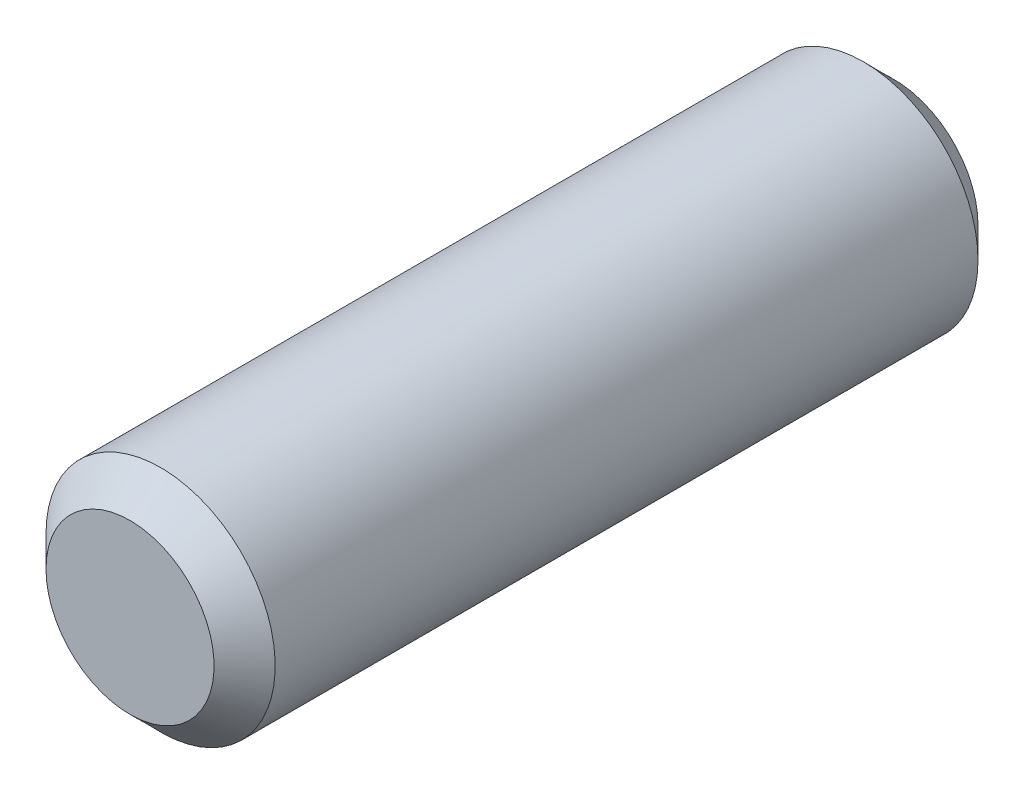
ISO-10303-21;
HEADER;
FILE_DESCRIPTION(('STEP AP214'),'2;1');
FILE_NAME('part.step','',(''),(''),'','','');
FILE_SCHEMA(('AUTOMOTIVE_DESIGN { 1 0 10303 214 1 1 1 1 }'));
ENDSEC;
DATA;
#1=APPLICATION_CONTEXT('core data for automotive mechanical design processes');
#2=APPLICATION_PROTOCOL_DEFINITION('international standard','automotive_design',2000,#1);
#3=PRODUCT_CONTEXT('',#1,'mechanical');
#4=PRODUCT('Part','Part','',(#3));
#5=PRODUCT_RELATED_PRODUCT_CATEGORY('part','',(#4));
#6=PRODUCT_DEFINITION_FORMATION('','',#4);
#7=PRODUCT_DEFINITION_CONTEXT('part definition',#1,'design');
#8=PRODUCT_DEFINITION('design','',#6,#7);
#9=PRODUCT_DEFINITION_SHAPE('','',#8);
#10=(LENGTH_UNIT() NAMED_UNIT(*) SI_UNIT(.MILLI.,.METRE.));
#11=(NAMED_UNIT(*) PLANE_ANGLE_UNIT() SI_UNIT($,.RADIAN.));
#12=(NAMED_UNIT(*) SI_UNIT($,.STERADIAN.) SOLID_ANGLE_UNIT());
#13=UNCERTAINTY_MEASURE_WITH_UNIT(LENGTH_MEASURE(1.E-05),#10,'distance_accuracy_value','');
#14=(GEOMETRIC_REPRESENTATION_CONTEXT(3) GLOBAL_UNCERTAINTY_ASSIGNED_CONTEXT((#13)) GLOBAL_UNIT_ASSIGNED_CONTEXT((#10,
#11,#12)) REPRESENTATION_CONTEXT('',''));
#15=CARTESIAN_POINT('',(0.,0.,0.));
#16=DIRECTION('',(0.,0.,1.));
#17=DIRECTION('',(1.,0.,0.));
#18=AXIS2_PLACEMENT_3D('',#15,#16,#17);
#19=CARTESIAN_POINT('',(0.,0.,10.));
#20=DIRECTION('',(0.,0.,-1.));
#21=DIRECTION('',(-1.,0.,0.));
#22=AXIS2_PLACEMENT_3D('',#19,#20,#21);
#23=CYLINDRICAL_SURFACE('',#22,1.5);
#24=CARTESIAN_POINT('',(0.,0.,0.400000000000003));
#25=DIRECTION('',(0.,0.,1.));
#26=DIRECTION('',(1.,0.,0.));
#27=AXIS2_PLACEMENT_3D('',#24,#25,#26);
#28=CIRCLE('',#27,1.5);
#29=CARTESIAN_POINT('',(1.5,0.,0.400000000000003));
#30=VERTEX_POINT('',#29);
#31=EDGE_CURVE('E55',#30,#30,#28,.T.);
#32=ORIENTED_EDGE('',*,*,#31,.T.);
#33=EDGE_LOOP('',(#32));
#34=FACE_BOUND('',#33,.T.);
#35=CARTESIAN_POINT('',(0.,0.,9.6));
#36=DIRECTION('',(0.,0.,1.));
#37=DIRECTION('',(1.,0.,0.));
#38=AXIS2_PLACEMENT_3D('',#35,#36,#37);
#39=CIRCLE('',#38,1.5);
#40=CARTESIAN_POINT('',(-1.5,0.,9.6));
#41=VERTEX_POINT('',#40);
#42=EDGE_CURVE('E59',#41,#41,#39,.F.);
#43=ORIENTED_EDGE('',*,*,#42,.T.);
#44=EDGE_LOOP('',(#43));
#45=FACE_BOUND('',#44,.T.);
#46=ADVANCED_FACE('F43',(#34,#45),#23,.T.);
#47=CARTESIAN_POINT('',(0.,0.,10.));
#48=DIRECTION('',(0.,0.,1.));
#49=DIRECTION('',(1.,0.,0.));
#50=AXIS2_PLACEMENT_3D('',#47,#48,#49);
#51=PLANE('',#50);
#52=CARTESIAN_POINT('',(0.,0.,10.));
#53=DIRECTION('',(0.,0.,1.));
#54=DIRECTION('',(1.,0.,0.));
#55=AXIS2_PLACEMENT_3D('',#52,#53,#54);
#56=CIRCLE('',#55,1.1);
#57=CARTESIAN_POINT('',(-1.1,0.,10.));
#58=VERTEX_POINT('',#57);
#59=EDGE_CURVE('E10',#58,#58,#56,.T.);
#60=ORIENTED_EDGE('',*,*,#59,.T.);
#61=EDGE_LOOP('',(#60));
#62=FACE_BOUND('',#61,.T.);
#63=ADVANCED_FACE('F75',(#62),#51,.T.);
#64=CARTESIAN_POINT('',(0.,0.,0.));
#65=DIRECTION('',(0.,0.,1.));
#66=DIRECTION('',(1.,0.,0.));
#67=AXIS2_PLACEMENT_3D('',#64,#65,#66);
#68=PLANE('',#67);
#69=CARTESIAN_POINT('',(0.,0.,0.));
#70=DIRECTION('',(0.,0.,1.));
#71=DIRECTION('',(1.,0.,0.));
#72=AXIS2_PLACEMENT_3D('',#69,#70,#71);
#73=CIRCLE('',#72,1.1);
#74=CARTESIAN_POINT('',(1.1,0.,0.));
#75=VERTEX_POINT('',#74);
#76=EDGE_CURVE('E51',#75,#75,#73,.F.);
#77=ORIENTED_EDGE('',*,*,#76,.T.);
#78=EDGE_LOOP('',(#77));
#79=FACE_BOUND('',#78,.T.);
#80=ADVANCED_FACE('F72',(#79),#68,.F.);
#81=CARTESIAN_POINT('',(0.,0.,0.400000000000003));
#82=DIRECTION('',(0.,0.,1.));
#83=DIRECTION('',(1.,0.,0.));
#84=AXIS2_PLACEMENT_3D('',#81,#82,#83);
#85=CONICAL_SURFACE('',#84,1.5,0.78539816339745);
#86=ORIENTED_EDGE('',*,*,#76,.F.);
#87=EDGE_LOOP('',(#86));
#88=FACE_BOUND('',#87,.T.);
#89=ORIENTED_EDGE('',*,*,#31,.F.);
#90=EDGE_LOOP('',(#89));
#91=FACE_BOUND('',#90,.T.);
#92=ADVANCED_FACE('F68',(#88,#91),#85,.T.);
#93=CARTESIAN_POINT('',(0.,0.,10.));
#94=DIRECTION('',(0.,0.,-1.));
#95=DIRECTION('',(-1.,0.,0.));
#96=AXIS2_PLACEMENT_3D('',#93,#94,#95);
#97=CONICAL_SURFACE('',#96,1.1,0.785398163397447);
#98=CARTESIAN_POINT('',(-1.5,0.,9.6));
#99=CARTESIAN_POINT('',(-1.49583333333333,0.,9.60416666666667));
#100=CARTESIAN_POINT('',(-1.49166666666667,0.,9.60833333333333));
#101=CARTESIAN_POINT('',(-1.48333333333333,0.,9.61666666666667));
#102=CARTESIAN_POINT('',(-1.47916666666667,0.,9.62083333333333));
#103=CARTESIAN_POINT('',(-1.47083333333333,0.,9.62916666666667));
#104=CARTESIAN_POINT('',(-1.46666666666667,0.,9.63333333333333));
#105=CARTESIAN_POINT('',(-1.45833333333333,0.,9.64166666666667));
#106=CARTESIAN_POINT('',(-1.45416666666667,0.,9.64583333333333));
#107=CARTESIAN_POINT('',(-1.44583333333334,0.,9.65416666666667));
#108=CARTESIAN_POINT('',(-1.44166666666667,0.,9.65833333333333));
#109=CARTESIAN_POINT('',(-1.43333333333333,0.,9.66666666666667));
#110=CARTESIAN_POINT('',(-1.42916666666667,0.,9.67083333333333));
#111=CARTESIAN_POINT('',(-1.42083333333333,0.,9.67916666666667));
#112=CARTESIAN_POINT('',(-1.41666666666667,0.,9.68333333333333));
#113=CARTESIAN_POINT('',(-1.40833333333333,0.,9.69166666666667));
#114=CARTESIAN_POINT('',(-1.40416666666667,0.,9.69583333333333));
#115=CARTESIAN_POINT('',(-1.39583333333334,0.,9.70416666666667));
#116=CARTESIAN_POINT('',(-1.39166666666667,0.,9.70833333333333));
#117=CARTESIAN_POINT('',(-1.38333333333333,0.,9.71666666666667));
#118=CARTESIAN_POINT('',(-1.37916666666667,0.,9.72083333333333));
#119=CARTESIAN_POINT('',(-1.37083333333333,0.,9.72916666666667));
#120=CARTESIAN_POINT('',(-1.36666666666667,0.,9.73333333333333));
#121=CARTESIAN_POINT('',(-1.35833333333334,0.,9.74166666666667));
#122=CARTESIAN_POINT('',(-1.35416666666667,0.,9.74583333333333));
#123=CARTESIAN_POINT('',(-1.34583333333334,0.,9.75416666666667));
#124=CARTESIAN_POINT('',(-1.34166666666667,0.,9.75833333333333));
#125=CARTESIAN_POINT('',(-1.33333333333334,0.,9.76666666666667));
#126=CARTESIAN_POINT('',(-1.32916666666667,0.,9.77083333333333));
#127=CARTESIAN_POINT('',(-1.32083333333334,0.,9.77916666666667));
#128=CARTESIAN_POINT('',(-1.31666666666667,0.,9.78333333333333));
#129=CARTESIAN_POINT('',(-1.30833333333334,0.,9.79166666666667));
#130=CARTESIAN_POINT('',(-1.30416666666667,0.,9.79583333333333));
#131=CARTESIAN_POINT('',(-1.29583333333334,0.,9.80416666666667));
#132=CARTESIAN_POINT('',(-1.29166666666667,0.,9.80833333333333));
#133=CARTESIAN_POINT('',(-1.28333333333334,0.,9.81666666666667));
#134=CARTESIAN_POINT('',(-1.27916666666667,0.,9.82083333333333));
#135=CARTESIAN_POINT('',(-1.27083333333334,0.,9.82916666666667));
#136=CARTESIAN_POINT('',(-1.26666666666667,0.,9.83333333333333));
#137=CARTESIAN_POINT('',(-1.25833333333334,0.,9.84166666666667));
#138=CARTESIAN_POINT('',(-1.25416666666667,0.,9.84583333333333));
#139=CARTESIAN_POINT('',(-1.24583333333334,0.,9.85416666666667));
#140=CARTESIAN_POINT('',(-1.24166666666667,0.,9.85833333333333));
#141=CARTESIAN_POINT('',(-1.23333333333334,0.,9.86666666666667));
#142=CARTESIAN_POINT('',(-1.22916666666667,0.,9.87083333333333));
#143=CARTESIAN_POINT('',(-1.22083333333334,0.,9.87916666666667));
#144=CARTESIAN_POINT('',(-1.21666666666667,0.,9.88333333333333));
#145=CARTESIAN_POINT('',(-1.20833333333334,0.,9.89166666666667));
#146=CARTESIAN_POINT('',(-1.20416666666667,0.,9.89583333333333));
#147=CARTESIAN_POINT('',(-1.19583333333334,0.,9.90416666666667));
#148=CARTESIAN_POINT('',(-1.19166666666667,0.,9.90833333333333));
#149=CARTESIAN_POINT('',(-1.18333333333334,0.,9.91666666666667));
#150=CARTESIAN_POINT('',(-1.17916666666667,0.,9.92083333333333));
#151=CARTESIAN_POINT('',(-1.17083333333334,0.,9.92916666666667));
#152=CARTESIAN_POINT('',(-1.16666666666667,0.,9.93333333333333));
#153=CARTESIAN_POINT('',(-1.15833333333334,0.,9.94166666666667));
#154=CARTESIAN_POINT('',(-1.15416666666667,0.,9.94583333333333));
#155=CARTESIAN_POINT('',(-1.14583333333334,0.,9.95416666666667));
#156=CARTESIAN_POINT('',(-1.14166666666667,0.,9.95833333333333));
#157=CARTESIAN_POINT('',(-1.13333333333334,0.,9.96666666666667));
#158=CARTESIAN_POINT('',(-1.12916666666667,0.,9.97083333333333));
#159=CARTESIAN_POINT('',(-1.12083333333334,0.,9.97916666666667));
#160=CARTESIAN_POINT('',(-1.11666666666667,0.,9.98333333333333));
#161=CARTESIAN_POINT('',(-1.10833333333334,0.,9.99166666666667));
#162=CARTESIAN_POINT('',(-1.10416666666667,0.,9.99583333333333));
#163=CARTESIAN_POINT('',(-1.1,0.,10.));
#164=B_SPLINE_CURVE_WITH_KNOTS('',3,(#98,#99,#100,#101,#102,#103,#104,#105,#106,#107,#108,#109,
#110,#111,#112,#113,#114,#115,#116,#117,#118,#119,#120,#121,#122,#123,#124,#125,#126,#127,#128,
#129,#130,#131,#132,#133,#134,#135,#136,#137,#138,#139,#140,#141,#142,#143,#144,#145,#146,#147,
#148,#149,#150,#151,#152,#153,#154,#155,#156,#157,#158,#159,#160,#161,#162,#163),.UNSPECIFIED.,
.F.,.F.,(4,2,2,2,2,2,2,2,2,2,2,2,2,2,2,2,2,2,2,2,2,2,2,2,2,2,2,2,2,2,2,2,4),(0.,
0.0176776695296639,0.0353553390593278,0.0530330085889918,0.0707106781186557,0.0883883476483184,
0.106066017177982,0.123743686707646,0.14142135623731,0.159099025766974,0.176776695296637,
0.194454364826301,0.212132034355965,0.229809703885628,0.247487373415291,0.265165042944955,
0.282842712474619,0.300520382004283,0.318198051533947,0.335875721063609,0.353553390593273,
0.371231060122937,0.388908729652601,0.406586399182264,0.424264068711928,0.441941738241591,
0.459619407771255,0.477297077300919,0.494974746830582,0.512652416360246,0.53033008588991,
0.548007755419574,0.565685424949238),.UNSPECIFIED.);
#165=EDGE_CURVE('BSEAM46',#41,#58,#164,.T.);
#166=ORIENTED_EDGE('',*,*,#42,.F.);
#167=ORIENTED_EDGE('',*,*,#59,.F.);
#168=ORIENTED_EDGE('',*,*,#165,.T.);
#169=ORIENTED_EDGE('',*,*,#165,.F.);
#170=EDGE_LOOP('',(#166,#168,#167,#169));
#171=FACE_BOUND('',#170,.T.);
#172=ADVANCED_FACE('F46',(#171),#97,.T.);
#173=CLOSED_SHELL('',(#46,#63,#80,#92,#172));
#174=MANIFOLD_SOLID_BREP('B2',#173);
#175=ADVANCED_BREP_SHAPE_REPRESENTATION('',(#18,#174),#14);
#176=SHAPE_DEFINITION_REPRESENTATION(#9,#175);
ENDSEC;
END-ISO-10303-21;
